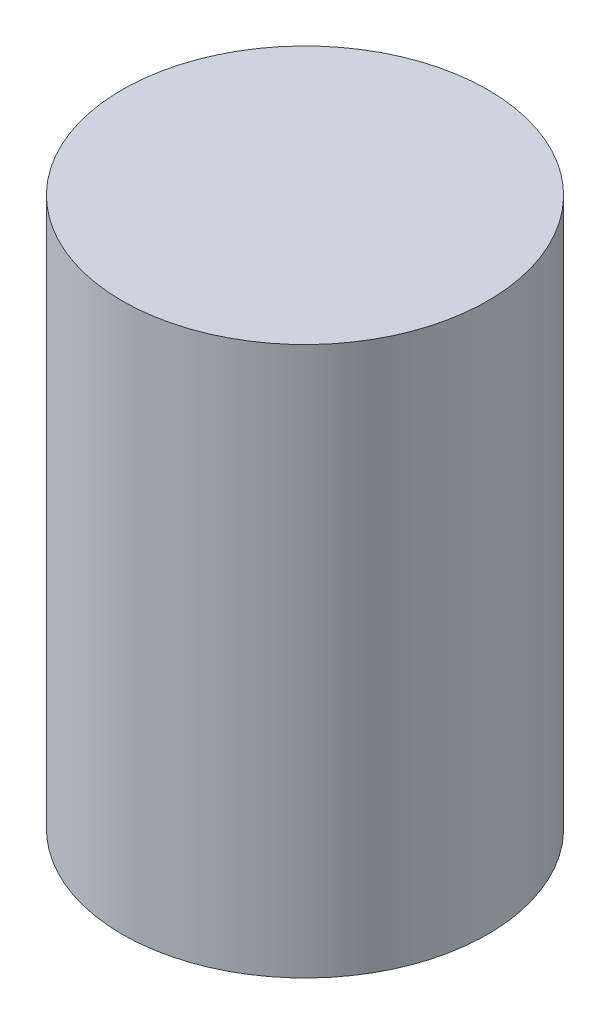
ISO-10303-21;
HEADER;
FILE_DESCRIPTION(('STEP AP214'),'2;1');
FILE_NAME('part.step','',(''),(''),'','','');
FILE_SCHEMA(('AUTOMOTIVE_DESIGN { 1 0 10303 214 1 1 1 1 }'));
ENDSEC;
DATA;
#1=APPLICATION_CONTEXT('core data for automotive mechanical design processes');
#2=APPLICATION_PROTOCOL_DEFINITION('international standard','automotive_design',2000,#1);
#3=PRODUCT_CONTEXT('',#1,'mechanical');
#4=PRODUCT('Part','Part','',(#3));
#5=PRODUCT_RELATED_PRODUCT_CATEGORY('part','',(#4));
#6=PRODUCT_DEFINITION_FORMATION('','',#4);
#7=PRODUCT_DEFINITION_CONTEXT('part definition',#1,'design');
#8=PRODUCT_DEFINITION('design','',#6,#7);
#9=PRODUCT_DEFINITION_SHAPE('','',#8);
#10=(LENGTH_UNIT() NAMED_UNIT(*) SI_UNIT(.MILLI.,.METRE.));
#11=(NAMED_UNIT(*) PLANE_ANGLE_UNIT() SI_UNIT($,.RADIAN.));
#12=(NAMED_UNIT(*) SI_UNIT($,.STERADIAN.) SOLID_ANGLE_UNIT());
#13=UNCERTAINTY_MEASURE_WITH_UNIT(LENGTH_MEASURE(1.E-05),#10,'distance_accuracy_value','');
#14=(GEOMETRIC_REPRESENTATION_CONTEXT(3) GLOBAL_UNCERTAINTY_ASSIGNED_CONTEXT((#13)) GLOBAL_UNIT_ASSIGNED_CONTEXT((#10,
#11,#12)) REPRESENTATION_CONTEXT('',''));
#15=CARTESIAN_POINT('',(0.,0.,0.));
#16=DIRECTION('',(0.,0.,1.));
#17=DIRECTION('',(1.,0.,0.));
#18=AXIS2_PLACEMENT_3D('',#15,#16,#17);
#19=CARTESIAN_POINT('',(0.,30.,0.));
#20=DIRECTION('',(0.,-1.,0.));
#21=DIRECTION('',(0.,0.,-1.));
#22=AXIS2_PLACEMENT_3D('',#19,#20,#21);
#23=CYLINDRICAL_SURFACE('',#22,10.);
#24=CARTESIAN_POINT('',(0.,30.,0.));
#25=DIRECTION('',(0.,1.,0.));
#26=DIRECTION('',(0.,0.,1.));
#27=AXIS2_PLACEMENT_3D('',#24,#25,#26);
#28=CIRCLE('',#27,10.);
#29=CARTESIAN_POINT('',(0.,30.,10.));
#30=VERTEX_POINT('',#29);
#31=EDGE_CURVE('E10',#30,#30,#28,.T.);
#32=ORIENTED_EDGE('',*,*,#31,.F.);
#33=EDGE_LOOP('',(#32));
#34=FACE_BOUND('',#33,.T.);
#35=CARTESIAN_POINT('',(0.,0.,0.));
#36=DIRECTION('',(0.,1.,0.));
#37=DIRECTION('',(0.,0.,1.));
#38=AXIS2_PLACEMENT_3D('',#35,#36,#37);
#39=CIRCLE('',#38,10.);
#40=CARTESIAN_POINT('',(0.,0.,10.));
#41=VERTEX_POINT('',#40);
#42=EDGE_CURVE('E36',#41,#41,#39,.T.);
#43=ORIENTED_EDGE('',*,*,#42,.T.);
#44=EDGE_LOOP('',(#43));
#45=FACE_BOUND('',#44,.T.);
#46=ADVANCED_FACE('F33',(#34,#45),#23,.T.);
#47=CARTESIAN_POINT('',(0.,30.,0.));
#48=DIRECTION('',(0.,1.,0.));
#49=DIRECTION('',(0.,0.,1.));
#50=AXIS2_PLACEMENT_3D('',#47,#48,#49);
#51=PLANE('',#50);
#52=ORIENTED_EDGE('',*,*,#31,.T.);
#53=EDGE_LOOP('',(#52));
#54=FACE_BOUND('',#53,.T.);
#55=ADVANCED_FACE('F48',(#54),#51,.T.);
#56=CARTESIAN_POINT('',(0.,0.,0.));
#57=DIRECTION('',(0.,1.,0.));
#58=DIRECTION('',(0.,0.,1.));
#59=AXIS2_PLACEMENT_3D('',#56,#57,#58);
#60=PLANE('',#59);
#61=ORIENTED_EDGE('',*,*,#42,.F.);
#62=EDGE_LOOP('',(#61));
#63=FACE_BOUND('',#62,.T.);
#64=ADVANCED_FACE('F46',(#63),#60,.F.);
#65=CLOSED_SHELL('',(#46,#55,#64));
#66=MANIFOLD_SOLID_BREP('B2',#65);
#67=ADVANCED_BREP_SHAPE_REPRESENTATION('',(#18,#66),#14);
#68=SHAPE_DEFINITION_REPRESENTATION(#9,#67);
ENDSEC;
END-ISO-10303-21;
